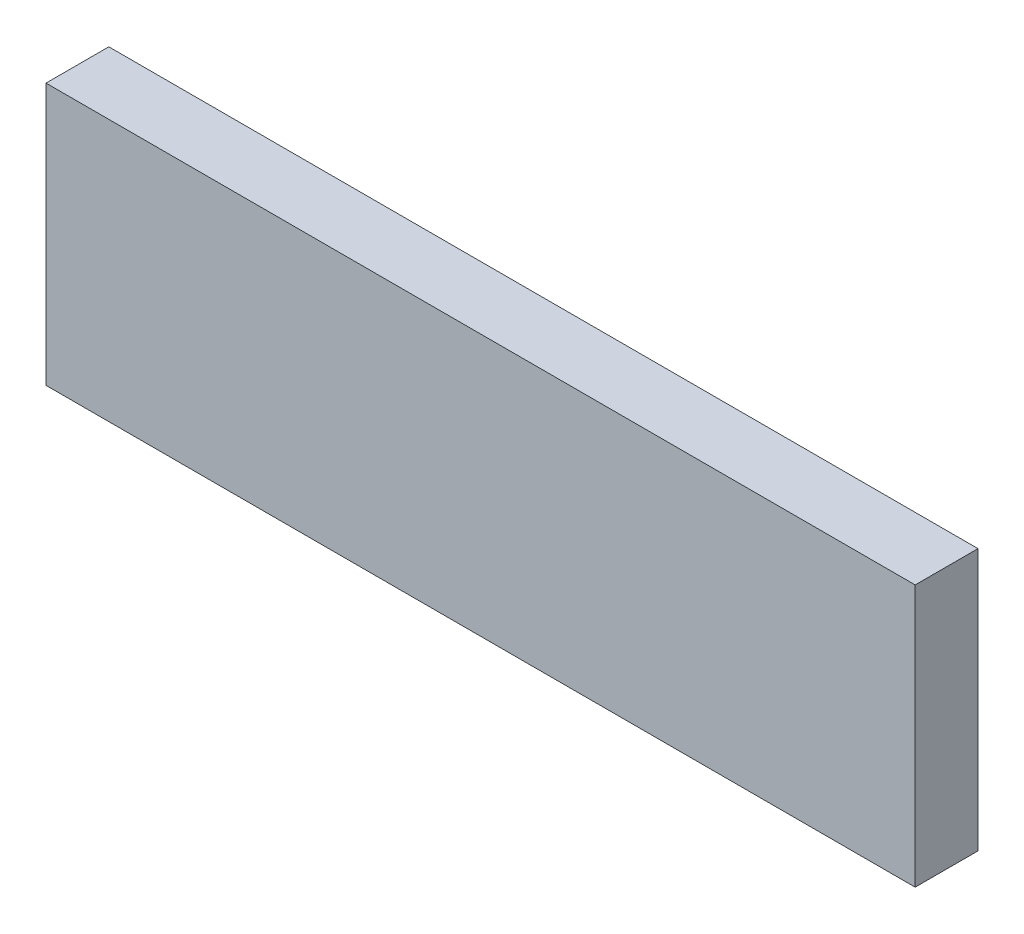
ISO-10303-21;
HEADER;
FILE_DESCRIPTION(('STEP AP214'),'2;1');
FILE_NAME('part.step','',(''),(''),'','','');
FILE_SCHEMA(('AUTOMOTIVE_DESIGN { 1 0 10303 214 1 1 1 1 }'));
ENDSEC;
DATA;
#1=APPLICATION_CONTEXT('core data for automotive mechanical design processes');
#2=APPLICATION_PROTOCOL_DEFINITION('international standard','automotive_design',2000,#1);
#3=PRODUCT_CONTEXT('',#1,'mechanical');
#4=PRODUCT('Part','Part','',(#3));
#5=PRODUCT_RELATED_PRODUCT_CATEGORY('part','',(#4));
#6=PRODUCT_DEFINITION_FORMATION('','',#4);
#7=PRODUCT_DEFINITION_CONTEXT('part definition',#1,'design');
#8=PRODUCT_DEFINITION('design','',#6,#7);
#9=PRODUCT_DEFINITION_SHAPE('','',#8);
#10=(LENGTH_UNIT() NAMED_UNIT(*) SI_UNIT(.MILLI.,.METRE.));
#11=(NAMED_UNIT(*) PLANE_ANGLE_UNIT() SI_UNIT($,.RADIAN.));
#12=(NAMED_UNIT(*) SI_UNIT($,.STERADIAN.) SOLID_ANGLE_UNIT());
#13=UNCERTAINTY_MEASURE_WITH_UNIT(LENGTH_MEASURE(1.E-05),#10,'distance_accuracy_value','');
#14=(GEOMETRIC_REPRESENTATION_CONTEXT(3) GLOBAL_UNCERTAINTY_ASSIGNED_CONTEXT((#13)) GLOBAL_UNIT_ASSIGNED_CONTEXT((#10,
#11,#12)) REPRESENTATION_CONTEXT('',''));
#15=CARTESIAN_POINT('',(0.,0.,0.));
#16=DIRECTION('',(0.,0.,1.));
#17=DIRECTION('',(1.,0.,0.));
#18=AXIS2_PLACEMENT_3D('',#15,#16,#17);
#19=CARTESIAN_POINT('',(583.,50.,12.));
#20=DIRECTION('',(-1.,0.,0.));
#21=DIRECTION('',(0.,0.,1.));
#22=AXIS2_PLACEMENT_3D('',#19,#20,#21);
#23=PLANE('',#22);
#24=DIRECTION('',(0.,1.,0.));
#25=VECTOR('',#24,1.);
#26=CARTESIAN_POINT('',(583.,50.,0.));
#27=LINE('',#26,#25);
#28=CARTESIAN_POINT('',(583.,0.,0.));
#29=VERTEX_POINT('',#28);
#30=CARTESIAN_POINT('',(583.,50.,0.));
#31=VERTEX_POINT('',#30);
#32=EDGE_CURVE('E96',#29,#31,#27,.T.);
#33=ORIENTED_EDGE('',*,*,#32,.T.);
#34=DIRECTION('',(0.,0.,-1.));
#35=VECTOR('',#34,1.);
#36=CARTESIAN_POINT('',(583.,50.,12.));
#37=LINE('',#36,#35);
#38=CARTESIAN_POINT('',(583.,50.,12.));
#39=VERTEX_POINT('',#38);
#40=EDGE_CURVE('E11',#39,#31,#37,.T.);
#41=ORIENTED_EDGE('',*,*,#40,.F.);
#42=DIRECTION('',(0.,1.,0.));
#43=VECTOR('',#42,1.);
#44=CARTESIAN_POINT('',(583.,50.,12.));
#45=LINE('',#44,#43);
#46=CARTESIAN_POINT('',(583.,0.,12.));
#47=VERTEX_POINT('',#46);
#48=EDGE_CURVE('E84',#47,#39,#45,.T.);
#49=ORIENTED_EDGE('',*,*,#48,.F.);
#50=DIRECTION('',(0.,0.,-1.));
#51=VECTOR('',#50,1.);
#52=CARTESIAN_POINT('',(583.,0.,12.));
#53=LINE('',#52,#51);
#54=EDGE_CURVE('E92',#47,#29,#53,.T.);
#55=ORIENTED_EDGE('',*,*,#54,.T.);
#56=EDGE_LOOP('',(#33,#41,#49,#55));
#57=FACE_BOUND('',#56,.T.);
#58=ADVANCED_FACE('F33',(#57),#23,.F.);
#59=CARTESIAN_POINT('',(417.,50.,12.));
#60=DIRECTION('',(0.,-1.,0.));
#61=DIRECTION('',(0.,0.,-1.));
#62=AXIS2_PLACEMENT_3D('',#59,#60,#61);
#63=PLANE('',#62);
#64=DIRECTION('',(-1.,0.,0.));
#65=VECTOR('',#64,1.);
#66=CARTESIAN_POINT('',(417.,50.,0.));
#67=LINE('',#66,#65);
#68=CARTESIAN_POINT('',(417.,50.,0.));
#69=VERTEX_POINT('',#68);
#70=EDGE_CURVE('E88',#31,#69,#67,.T.);
#71=ORIENTED_EDGE('',*,*,#70,.T.);
#72=DIRECTION('',(0.,0.,-1.));
#73=VECTOR('',#72,1.);
#74=CARTESIAN_POINT('',(417.,50.,12.));
#75=LINE('',#74,#73);
#76=CARTESIAN_POINT('',(417.,50.,12.));
#77=VERTEX_POINT('',#76);
#78=EDGE_CURVE('E41',#77,#69,#75,.T.);
#79=ORIENTED_EDGE('',*,*,#78,.F.);
#80=DIRECTION('',(-1.,0.,0.));
#81=VECTOR('',#80,1.);
#82=CARTESIAN_POINT('',(417.,50.,12.));
#83=LINE('',#82,#81);
#84=EDGE_CURVE('E79',#39,#77,#83,.T.);
#85=ORIENTED_EDGE('',*,*,#84,.F.);
#86=ORIENTED_EDGE('',*,*,#40,.T.);
#87=EDGE_LOOP('',(#71,#79,#85,#86));
#88=FACE_BOUND('',#87,.T.);
#89=ADVANCED_FACE('F87',(#88),#63,.F.);
#90=CARTESIAN_POINT('',(417.,50.,12.));
#91=DIRECTION('',(1.,0.,0.));
#92=DIRECTION('',(0.,1.,0.));
#93=AXIS2_PLACEMENT_3D('',#90,#91,#92);
#94=PLANE('',#93);
#95=DIRECTION('',(0.,-1.,0.));
#96=VECTOR('',#95,1.);
#97=CARTESIAN_POINT('',(417.,50.,0.));
#98=LINE('',#97,#96);
#99=CARTESIAN_POINT('',(417.,0.,0.));
#100=VERTEX_POINT('',#99);
#101=EDGE_CURVE('E66',#69,#100,#98,.T.);
#102=ORIENTED_EDGE('',*,*,#101,.T.);
#103=DIRECTION('',(0.,0.,-1.));
#104=VECTOR('',#103,1.);
#105=CARTESIAN_POINT('',(417.,0.,12.));
#106=LINE('',#105,#104);
#107=CARTESIAN_POINT('',(417.,0.,12.));
#108=VERTEX_POINT('',#107);
#109=EDGE_CURVE('E89',#108,#100,#106,.T.);
#110=ORIENTED_EDGE('',*,*,#109,.F.);
#111=DIRECTION('',(0.,-1.,0.));
#112=VECTOR('',#111,1.);
#113=CARTESIAN_POINT('',(417.,50.,12.));
#114=LINE('',#113,#112);
#115=EDGE_CURVE('E82',#77,#108,#114,.T.);
#116=ORIENTED_EDGE('',*,*,#115,.F.);
#117=ORIENTED_EDGE('',*,*,#78,.T.);
#118=EDGE_LOOP('',(#102,#110,#116,#117));
#119=FACE_BOUND('',#118,.T.);
#120=ADVANCED_FACE('F90',(#119),#94,.F.);
#121=CARTESIAN_POINT('',(417.,0.,12.));
#122=DIRECTION('',(0.,1.,0.));
#123=DIRECTION('',(-1.,0.,0.));
#124=AXIS2_PLACEMENT_3D('',#121,#122,#123);
#125=PLANE('',#124);
#126=DIRECTION('',(1.,0.,0.));
#127=VECTOR('',#126,1.);
#128=CARTESIAN_POINT('',(417.,0.,0.));
#129=LINE('',#128,#127);
#130=EDGE_CURVE('E72',#100,#29,#129,.T.);
#131=ORIENTED_EDGE('',*,*,#130,.T.);
#132=ORIENTED_EDGE('',*,*,#54,.F.);
#133=DIRECTION('',(1.,0.,0.));
#134=VECTOR('',#133,1.);
#135=CARTESIAN_POINT('',(417.,0.,12.));
#136=LINE('',#135,#134);
#137=EDGE_CURVE('E49',#108,#47,#136,.T.);
#138=ORIENTED_EDGE('',*,*,#137,.F.);
#139=ORIENTED_EDGE('',*,*,#109,.T.);
#140=EDGE_LOOP('',(#131,#132,#138,#139));
#141=FACE_BOUND('',#140,.T.);
#142=ADVANCED_FACE('F103',(#141),#125,.F.);
#143=CARTESIAN_POINT('',(0.,0.,12.));
#144=DIRECTION('',(0.,0.,1.));
#145=DIRECTION('',(1.,0.,0.));
#146=AXIS2_PLACEMENT_3D('',#143,#144,#145);
#147=PLANE('',#146);
#148=ORIENTED_EDGE('',*,*,#48,.T.);
#149=ORIENTED_EDGE('',*,*,#84,.T.);
#150=ORIENTED_EDGE('',*,*,#115,.T.);
#151=ORIENTED_EDGE('',*,*,#137,.T.);
#152=EDGE_LOOP('',(#148,#149,#150,#151));
#153=FACE_BOUND('',#152,.T.);
#154=ADVANCED_FACE('F80',(#153),#147,.T.);
#155=CARTESIAN_POINT('',(0.,0.,0.));
#156=DIRECTION('',(0.,0.,1.));
#157=DIRECTION('',(1.,0.,0.));
#158=AXIS2_PLACEMENT_3D('',#155,#156,#157);
#159=PLANE('',#158);
#160=ORIENTED_EDGE('',*,*,#32,.F.);
#161=ORIENTED_EDGE('',*,*,#130,.F.);
#162=ORIENTED_EDGE('',*,*,#101,.F.);
#163=ORIENTED_EDGE('',*,*,#70,.F.);
#164=EDGE_LOOP('',(#160,#161,#162,#163));
#165=FACE_BOUND('',#164,.T.);
#166=ADVANCED_FACE('F106',(#165),#159,.F.);
#167=CLOSED_SHELL('',(#58,#89,#120,#142,#154,#166));
#168=MANIFOLD_SOLID_BREP('B2',#167);
#169=ADVANCED_BREP_SHAPE_REPRESENTATION('',(#18,#168),#14);
#170=SHAPE_DEFINITION_REPRESENTATION(#9,#169);
ENDSEC;
END-ISO-10303-21;
